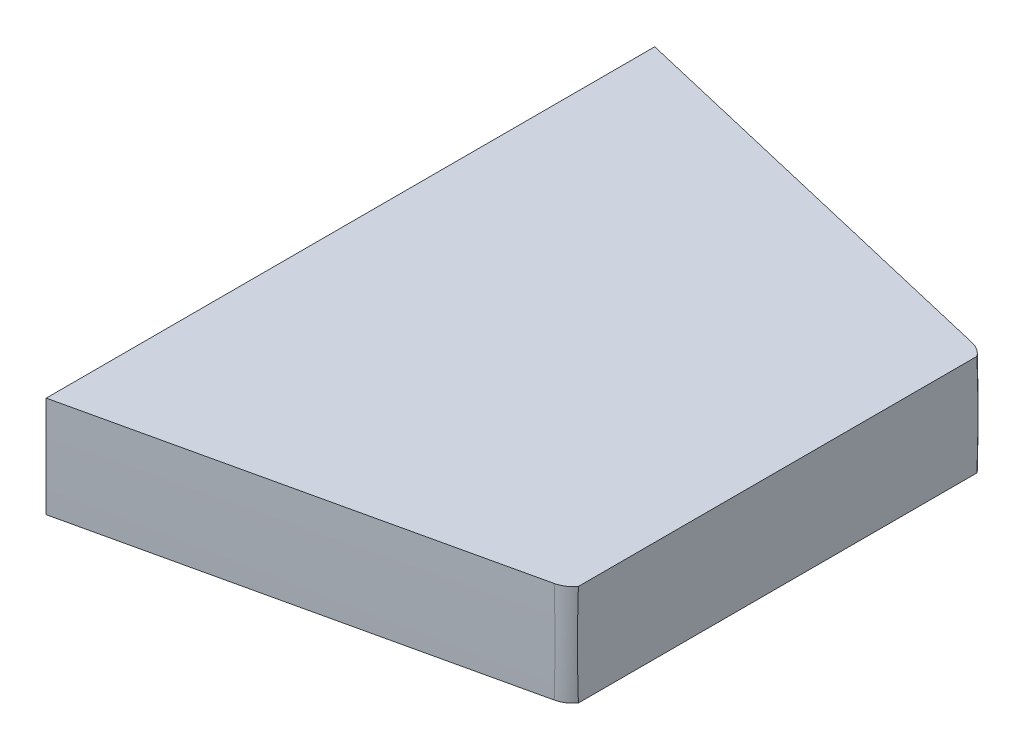
ISO-10303-21;
HEADER;
FILE_DESCRIPTION(('STEP AP214'),'2;1');
FILE_NAME('part.step','',(''),(''),'','','');
FILE_SCHEMA(('AUTOMOTIVE_DESIGN { 1 0 10303 214 1 1 1 1 }'));
ENDSEC;
DATA;
#1=APPLICATION_CONTEXT('core data for automotive mechanical design processes');
#2=APPLICATION_PROTOCOL_DEFINITION('international standard','automotive_design',2000,#1);
#3=PRODUCT_CONTEXT('',#1,'mechanical');
#4=PRODUCT('Part','Part','',(#3));
#5=PRODUCT_RELATED_PRODUCT_CATEGORY('part','',(#4));
#6=PRODUCT_DEFINITION_FORMATION('','',#4);
#7=PRODUCT_DEFINITION_CONTEXT('part definition',#1,'design');
#8=PRODUCT_DEFINITION('design','',#6,#7);
#9=PRODUCT_DEFINITION_SHAPE('','',#8);
#10=(LENGTH_UNIT() NAMED_UNIT(*) SI_UNIT(.MILLI.,.METRE.));
#11=(NAMED_UNIT(*) PLANE_ANGLE_UNIT() SI_UNIT($,.RADIAN.));
#12=(NAMED_UNIT(*) SI_UNIT($,.STERADIAN.) SOLID_ANGLE_UNIT());
#13=UNCERTAINTY_MEASURE_WITH_UNIT(LENGTH_MEASURE(1.E-05),#10,'distance_accuracy_value','');
#14=(GEOMETRIC_REPRESENTATION_CONTEXT(3) GLOBAL_UNCERTAINTY_ASSIGNED_CONTEXT((#13)) GLOBAL_UNIT_ASSIGNED_CONTEXT((#10,
#11,#12)) REPRESENTATION_CONTEXT('',''));
#15=CARTESIAN_POINT('',(0.,0.,0.));
#16=DIRECTION('',(0.,0.,1.));
#17=DIRECTION('',(1.,0.,0.));
#18=AXIS2_PLACEMENT_3D('',#15,#16,#17);
#19=CARTESIAN_POINT('',(1.63861979540769E-11,-5.18790739534314E-13,12.5584214245509));
#20=DIRECTION('',(0.,0.,-1.));
#21=DIRECTION('',(-1.,0.,0.));
#22=AXIS2_PLACEMENT_3D('',#19,#20,#21);
#23=CONICAL_SURFACE('',#22,33.2247053870836,1.34888360871233);
#24=CARTESIAN_POINT('',(33.2096529344975,-1.00000001490116,12.5584214245498));
#25=CARTESIAN_POINT('',(31.8413887405276,-1.00000001490116,12.8670076237268));
#26=CARTESIAN_POINT('',(30.4731189300786,-1.00000001490116,13.1755689153382));
#27=CARTESIAN_POINT('',(27.7365680760949,-1.00000001490116,13.7926416834585));
#28=CARTESIAN_POINT('',(26.3682870325602,-1.00000001490116,14.1011531599675));
#29=CARTESIAN_POINT('',(25.0000003725464,-1.00000001490116,14.4096397289109));
#30=B_SPLINE_CURVE_WITH_KNOTS('',3,(#24,#25,#26,#27,#28,#29),.UNSPECIFIED.,.F.,.F.,(4,2,4),(0.,
4.20789152709554,8.41578305458392),.UNSPECIFIED.);
#31=CARTESIAN_POINT('',(33.2096529344975,-1.00000001490116,12.5584214245498));
#32=VERTEX_POINT('',#31);
#33=CARTESIAN_POINT('',(25.0000003725464,-1.00000001490116,14.4096397289109));
#34=VERTEX_POINT('',#33);
#35=EDGE_CURVE('E74',#32,#34,#30,.T.);
#36=ORIENTED_EDGE('',*,*,#35,.F.);
#37=CARTESIAN_POINT('',(-7.17828574359203E-12,-7.0830927928478E-13,12.5584214245498));
#38=DIRECTION('',(0.,0.,-1.));
#39=DIRECTION('',(-1.,0.,0.));
#40=AXIS2_PLACEMENT_3D('',#37,#38,#39);
#41=CIRCLE('',#40,33.224705387107);
#42=CARTESIAN_POINT('',(33.2096529344976,1.00000001489884,12.5584214245498));
#43=VERTEX_POINT('',#42);
#44=EDGE_CURVE('E81',#43,#32,#41,.T.);
#45=ORIENTED_EDGE('',*,*,#44,.F.);
#46=CARTESIAN_POINT('',(25.0000003725464,1.00000001489884,14.4096397289109));
#47=CARTESIAN_POINT('',(26.3682870325602,1.00000001489884,14.1011531599675));
#48=CARTESIAN_POINT('',(27.7365680760949,1.00000001489884,13.7926416834585));
#49=CARTESIAN_POINT('',(30.4731189300787,1.00000001489884,13.1755689153382));
#50=CARTESIAN_POINT('',(31.8413887405276,1.00000001489884,12.8670076237268));
#51=CARTESIAN_POINT('',(33.2096529344976,1.00000001489884,12.5584214245498));
#52=B_SPLINE_CURVE_WITH_KNOTS('',3,(#46,#47,#48,#49,#50,#51),.UNSPECIFIED.,.F.,.F.,(4,2,4),(0.,
4.20789152748842,8.41578305458399),.UNSPECIFIED.);
#53=CARTESIAN_POINT('',(25.0000003725464,1.00000001489884,14.4096397289109));
#54=VERTEX_POINT('',#53);
#55=EDGE_CURVE('E77',#54,#43,#52,.T.);
#56=ORIENTED_EDGE('',*,*,#55,.F.);
#57=CARTESIAN_POINT('',(25.0000003725464,-1.00000001490115,14.4096397289109));
#58=CARTESIAN_POINT('',(25.0000003725464,-0.666666676601154,14.4126469085399));
#59=CARTESIAN_POINT('',(25.0000003725464,-0.333333338301154,14.4141504983544));
#60=CARTESIAN_POINT('',(25.0000003725464,0.333333338298848,14.4141504983544));
#61=CARTESIAN_POINT('',(25.0000003725464,0.666666676598849,14.4126469085399));
#62=CARTESIAN_POINT('',(25.0000003725464,1.00000001489885,14.4096397289109));
#63=B_SPLINE_CURVE_WITH_KNOTS('',3,(#57,#58,#59,#60,#61,#62),.UNSPECIFIED.,.F.,.F.,(4,2,4),(0.,
1.00001018836859,2.00002037673717),.UNSPECIFIED.);
#64=EDGE_CURVE('E22',#34,#54,#63,.T.);
#65=ORIENTED_EDGE('',*,*,#64,.F.);
#66=EDGE_LOOP('',(#36,#45,#56,#65));
#67=FACE_BOUND('',#66,.T.);
#68=ADVANCED_FACE('F17',(#67),#23,.T.);
#69=CARTESIAN_POINT('',(25.0000003725464,-1.01000001490116,2.33806122525438));
#70=DIRECTION('',(-1.,0.,0.));
#71=DIRECTION('',(0.,0.,1.));
#72=AXIS2_PLACEMENT_3D('',#69,#70,#71);
#73=PLANE('',#72);
#74=CARTESIAN_POINT('',(25.0000003725464,-1.00000001490119,2.35746474966418));
#75=CARTESIAN_POINT('',(25.000000298224,-0.916652167432191,2.35668095743818));
#76=CARTESIAN_POINT('',(25.0000001193455,-0.833303399463384,2.35599498502336));
#77=CARTESIAN_POINT('',(24.9999998223228,-0.666627191496445,2.35481907453882));
#78=CARTESIAN_POINT('',(24.9999997041619,-0.583299751874755,2.35432908310761));
#79=CARTESIAN_POINT('',(24.999999798083,-0.416649568633765,2.35354512839005));
#80=CARTESIAN_POINT('',(25.0000000101426,-0.333326825076644,2.35325115188909));
#81=CARTESIAN_POINT('',(25.0000005068397,-0.166669387722417,2.35285917759171));
#82=CARTESIAN_POINT('',(25.0000007914873,-0.0833346938617517,2.35276120682422));
#83=CARTESIAN_POINT('',(25.0000007914873,0.0833346938595561,2.35276120682422));
#84=CARTESIAN_POINT('',(25.0000005068397,0.166669387720199,2.35285917759171));
#85=CARTESIAN_POINT('',(25.0000000101426,0.333326825074382,2.35325115188909));
#86=CARTESIAN_POINT('',(24.999999798083,0.416649568631481,2.35354512839005));
#87=CARTESIAN_POINT('',(24.9999997041619,0.583299751872433,2.35432908310761));
#88=CARTESIAN_POINT('',(24.9999998223228,0.666627191494109,2.35481907453882));
#89=CARTESIAN_POINT('',(25.0000001193455,0.833303399461025,2.35599498502336));
#90=CARTESIAN_POINT('',(25.000000298224,0.916652167429825,2.35668095743817));
#91=CARTESIAN_POINT('',(25.0000003725464,1.00000001489882,2.35746474966418));
#92=B_SPLINE_CURVE_WITH_KNOTS('',3,(#74,#75,#76,#77,#78,#79,#80,#81,#82,#83,#84,#85,#86,#87,#88,
#89,#90,#91),.UNSPECIFIED.,.F.,.F.,(4,2,2,2,2,2,2,2,4),(0.,0.25005454168592,0.50004095237242,
0.750010508185632,1.00001453208714,1.25001855598858,1.49998811180173,1.74997452248818,
2.00002906417408),.UNSPECIFIED.);
#93=CARTESIAN_POINT('',(25.0000003725464,-1.00000001490118,2.35746474966418));
#94=VERTEX_POINT('',#93);
#95=CARTESIAN_POINT('',(25.0000003725464,1.00000001489884,2.35746474966418));
#96=VERTEX_POINT('',#95);
#97=EDGE_CURVE('E87',#94,#96,#92,.T.);
#98=ORIENTED_EDGE('',*,*,#97,.F.);
#99=DIRECTION('',(0.,0.,-1.));
#100=VECTOR('',#99,1.);
#101=CARTESIAN_POINT('',(25.0000003725464,-1.00000001490116,8.38355223928756));
#102=LINE('',#101,#100);
#103=EDGE_CURVE('E84',#34,#94,#102,.T.);
#104=ORIENTED_EDGE('',*,*,#103,.F.);
#105=ORIENTED_EDGE('',*,*,#64,.T.);
#106=DIRECTION('',(0.,0.,1.));
#107=VECTOR('',#106,1.);
#108=CARTESIAN_POINT('',(25.0000003725464,1.00000001489884,8.38355223928754));
#109=LINE('',#108,#107);
#110=EDGE_CURVE('E124',#96,#54,#109,.T.);
#111=ORIENTED_EDGE('',*,*,#110,.F.);
#112=EDGE_LOOP('',(#98,#104,#105,#111));
#113=FACE_BOUND('',#112,.T.);
#114=ADVANCED_FACE('F85',(#113),#73,.T.);
#115=CARTESIAN_POINT('',(1.27189925258619E-11,-7.28367019475762E-13,12.0706822982081));
#116=DIRECTION('',(0.,0.,-1.));
#117=DIRECTION('',(-1.,0.,0.));
#118=AXIS2_PLACEMENT_3D('',#115,#116,#117);
#119=TOROIDAL_SURFACE('',#118,33.1146574673646,0.499999999999809);
#120=CARTESIAN_POINT('',(33.5000003725465,-1.00000001490116,12.3703286992378));
#121=CARTESIAN_POINT('',(33.4829055419209,-1.00000001490116,12.3931883182461));
#122=CARTESIAN_POINT('',(33.4638278411576,-1.00000001490116,12.4145480482806));
#123=CARTESIAN_POINT('',(33.4229271085558,-1.00000001490116,12.4531581174169));
#124=CARTESIAN_POINT('',(33.4011991952655,-1.00000001490116,12.4705092618969));
#125=CARTESIAN_POINT('',(33.3530501589402,-1.00000001490116,12.5027839242995));
#126=CARTESIAN_POINT('',(33.326381449298,-1.00000001490116,12.5173395018995));
#127=CARTESIAN_POINT('',(33.2699629830464,-1.00000001490116,12.5418209984451));
#128=CARTESIAN_POINT('',(33.2401413125483,-1.00000001490116,12.5515812912889));
#129=CARTESIAN_POINT('',(33.2096529344975,-1.00000001490116,12.5584214245498));
#130=B_SPLINE_CURVE_WITH_KNOTS('',3,(#120,#121,#122,#123,#124,#125,#126,#127,#128,#129),
.UNSPECIFIED.,.F.,.F.,(4,2,2,2,4),(0.,0.0855072323680957,0.16854675970834,0.259192469447956,
0.352780715745465),.UNSPECIFIED.);
#131=CARTESIAN_POINT('',(33.5000003725464,-1.00000001490116,12.3703286992378));
#132=VERTEX_POINT('',#131);
#133=EDGE_CURVE('E95',#132,#32,#130,.T.);
#134=ORIENTED_EDGE('',*,*,#133,.F.);
#135=CARTESIAN_POINT('',(33.5000003725464,1.00000001489884,12.3703286992379));
#136=CARTESIAN_POINT('',(33.5000003725464,0.916692201357339,12.3736426204402));
#137=CARTESIAN_POINT('',(33.5000003725464,0.833366493608387,12.3764702957254));
#138=CARTESIAN_POINT('',(33.5000003725464,0.666691093795641,12.3812395684105));
#139=CARTESIAN_POINT('',(33.5000003725464,0.583341402197826,12.3831811819972));
#140=CARTESIAN_POINT('',(33.5000003725464,0.333330278767769,12.3878055746088));
#141=CARTESIAN_POINT('',(33.5000003725464,0.166646031841015,12.3892901958144));
#142=CARTESIAN_POINT('',(33.5000003725464,-0.166709724574945,12.3892897344554));
#143=CARTESIAN_POINT('',(33.5000003725464,-0.333381234064518,12.3878048787313));
#144=CARTESIAN_POINT('',(33.5000003725464,-0.58337324995586,12.3831804699699));
#145=CARTESIAN_POINT('',(33.5000003725464,-0.666716569744633,12.3812389070245));
#146=CARTESIAN_POINT('',(33.5000003725464,-0.83337922888997,12.3764698643247));
#147=CARTESIAN_POINT('',(33.5000003725464,-0.916698567780592,12.3736423683853));
#148=CARTESIAN_POINT('',(33.5000003725464,-1.00000001490116,12.3703286992379));
#149=B_SPLINE_CURVE_WITH_KNOTS('',3,(#135,#136,#137,#138,#139,#140,#141,#142,#143,#144,#145,
#146,#147,#148),.UNSPECIFIED.,.F.,.F.,(4,2,2,2,2,2,4),(0.,0.250117350514379,0.500230131639355,
1.00027329810707,1.50027826738761,1.75037193552021,2.00047017287133),.UNSPECIFIED.);
#150=CARTESIAN_POINT('',(33.5000003725464,1.00000001489884,12.3703286992379));
#151=VERTEX_POINT('',#150);
#152=EDGE_CURVE('E158',#151,#132,#149,.T.);
#153=ORIENTED_EDGE('',*,*,#152,.F.);
#154=CARTESIAN_POINT('',(33.2096529344976,1.00000001489884,12.5584214245498));
#155=CARTESIAN_POINT('',(33.2375087140054,1.00000001489884,12.5521604756913));
#156=CARTESIAN_POINT('',(33.2648065271506,1.00000001489884,12.5434777025176));
#157=CARTESIAN_POINT('',(33.3167735197107,1.00000001489884,12.5219270480837));
#158=CARTESIAN_POINT('',(33.3414958304627,1.00000001489884,12.5091872045349));
#159=CARTESIAN_POINT('',(33.3906323176512,1.00000001489884,12.4784366850298));
#160=CARTESIAN_POINT('',(33.4148130226401,1.00000001489884,12.4600514291806));
#161=CARTESIAN_POINT('',(33.4602082221341,1.00000001489884,12.4185769207837));
#162=CARTESIAN_POINT('',(33.4813009797429,1.00000001489884,12.395354366991));
#163=CARTESIAN_POINT('',(33.5000003725465,1.00000001489884,12.3703286992378));
#164=B_SPLINE_CURVE_WITH_KNOTS('',3,(#154,#155,#156,#157,#158,#159,#160,#161,#162,#163),
.UNSPECIFIED.,.F.,.F.,(4,2,2,2,4),(0.,0.0855261834676214,0.168583650326287,0.259211530565942,
0.352780705589164),.UNSPECIFIED.);
#165=EDGE_CURVE('E147',#43,#151,#164,.T.);
#166=ORIENTED_EDGE('',*,*,#165,.F.);
#167=ORIENTED_EDGE('',*,*,#44,.T.);
#168=EDGE_LOOP('',(#134,#153,#166,#167));
#169=FACE_BOUND('',#168,.T.);
#170=ADVANCED_FACE('F152',(#169),#119,.T.);
#171=CARTESIAN_POINT('',(33.5100003725464,-1.00000001490116,14.4196397289109));
#172=DIRECTION('',(0.,-1.,0.));
#173=DIRECTION('',(-1.,0.,0.));
#174=AXIS2_PLACEMENT_3D('',#171,#172,#173);
#175=PLANE('',#174);
#176=CARTESIAN_POINT('',(33.214118396031,-1.00000001490116,4.28888778514572));
#177=CARTESIAN_POINT('',(33.2419096820321,-1.00000001490116,4.29540152126857));
#178=CARTESIAN_POINT('',(33.2691218907784,-1.00000001490116,4.30433206715076));
#179=CARTESIAN_POINT('',(33.3208900764462,-1.00000001490116,4.32635652471382));
#180=CARTESIAN_POINT('',(33.3454996520018,-1.00000001490116,4.33932453025365));
#181=CARTESIAN_POINT('',(33.3937392591226,-1.00000001490116,4.37013124788007));
#182=CARTESIAN_POINT('',(33.4172034575591,-1.00000001490116,4.38823037852797));
#183=CARTESIAN_POINT('',(33.4612766009286,-1.00000001490116,4.42888576455644));
#184=CARTESIAN_POINT('',(33.4817734291207,-1.00000001490116,4.45156361153741));
#185=CARTESIAN_POINT('',(33.5000003725465,-1.00000001490116,4.47595192312837));
#186=B_SPLINE_CURVE_WITH_KNOTS('',3,(#176,#177,#178,#179,#180,#181,#182,#183,#184,#185),
.UNSPECIFIED.,.F.,.F.,(4,2,2,2,4),(0.,0.0855094655501174,0.168581977583652,0.257018074925815,
0.348217305348182),.UNSPECIFIED.);
#187=CARTESIAN_POINT('',(33.214118396031,-1.00000001490116,4.28888778514572));
#188=VERTEX_POINT('',#187);
#189=CARTESIAN_POINT('',(33.5000003725464,-1.00000001490116,4.47595192312837));
#190=VERTEX_POINT('',#189);
#191=EDGE_CURVE('E91',#188,#190,#186,.T.);
#192=ORIENTED_EDGE('',*,*,#191,.T.);
#193=DIRECTION('',(0.,0.,-1.));
#194=VECTOR('',#193,1.);
#195=CARTESIAN_POINT('',(33.5000003725464,-1.00000001490116,8.42314031118308));
#196=LINE('',#195,#194);
#197=EDGE_CURVE('E163',#132,#190,#196,.T.);
#198=ORIENTED_EDGE('',*,*,#197,.F.);
#199=ORIENTED_EDGE('',*,*,#133,.T.);
#200=ORIENTED_EDGE('',*,*,#35,.T.);
#201=ORIENTED_EDGE('',*,*,#103,.T.);
#202=CARTESIAN_POINT('',(33.214118396031,-1.00000001490116,4.28888778514572));
#203=CARTESIAN_POINT('',(31.8451108988778,-1.00000001490116,3.96693217403391));
#204=CARTESIAN_POINT('',(30.4760973150453,-1.00000001490116,3.64500244886265));
#205=CARTESIAN_POINT('',(27.7380579738837,-1.00000001490116,3.0011947703688));
#206=CARTESIAN_POINT('',(26.3690322165547,-1.00000001490116,2.67931681704621));
#207=CARTESIAN_POINT('',(25.0000003725464,-1.00000001490116,2.35746474966418));
#208=B_SPLINE_CURVE_WITH_KNOTS('',3,(#202,#203,#204,#205,#206,#207),.UNSPECIFIED.,.F.,.F.,(4,2,
4),(0.,4.21906772474692,8.43813544991903),.UNSPECIFIED.);
#209=EDGE_CURVE('E123',#188,#94,#208,.T.);
#210=ORIENTED_EDGE('',*,*,#209,.F.);
#211=EDGE_LOOP('',(#192,#198,#199,#200,#201,#210));
#212=FACE_BOUND('',#211,.T.);
#213=ADVANCED_FACE('F93',(#212),#175,.T.);
#214=CARTESIAN_POINT('',(24.9900003725464,1.00000001489884,14.4196397289109));
#215=DIRECTION('',(0.,1.,0.));
#216=DIRECTION('',(1.,0.,0.));
#217=AXIS2_PLACEMENT_3D('',#214,#215,#216);
#218=PLANE('',#217);
#219=ORIENTED_EDGE('',*,*,#110,.T.);
#220=ORIENTED_EDGE('',*,*,#55,.T.);
#221=ORIENTED_EDGE('',*,*,#165,.T.);
#222=DIRECTION('',(0.,0.,1.));
#223=VECTOR('',#222,1.);
#224=CARTESIAN_POINT('',(33.5000003725464,1.00000001489884,8.42314031118308));
#225=LINE('',#224,#223);
#226=CARTESIAN_POINT('',(33.5000003725464,1.00000001489884,4.4759519231283));
#227=VERTEX_POINT('',#226);
#228=EDGE_CURVE('E182',#227,#151,#225,.T.);
#229=ORIENTED_EDGE('',*,*,#228,.F.);
#230=CARTESIAN_POINT('',(33.5000003725464,1.00000001489884,4.47595192312832));
#231=CARTESIAN_POINT('',(33.482909623567,1.00000001489884,4.45309675462603));
#232=CARTESIAN_POINT('',(33.4638353847154,1.00000001489884,4.43174062068682));
#233=CARTESIAN_POINT('',(33.4229350065356,1.00000001489884,4.39312906945116));
#234=CARTESIAN_POINT('',(33.4012027661312,1.00000001489884,4.37577414574384));
#235=CARTESIAN_POINT('',(33.3536588614985,1.00000001489884,4.34390429883232));
#236=CARTESIAN_POINT('',(33.3276738661658,1.00000001489884,4.32964724850724));
#237=CARTESIAN_POINT('',(33.272762414234,1.00000001489884,4.30553385058148));
#238=CARTESIAN_POINT('',(33.2437694115084,1.00000001489884,4.2958289536019));
#239=CARTESIAN_POINT('',(33.2141183960311,1.00000001489884,4.28888778514573));
#240=B_SPLINE_CURVE_WITH_KNOTS('',3,(#230,#231,#232,#233,#234,#235,#236,#237,#238,#239),
.UNSPECIFIED.,.F.,.F.,(4,2,2,2,4),(0.,0.0854913742692753,0.168546763024155,0.256999909325981,
0.348217312733459),.UNSPECIFIED.);
#241=CARTESIAN_POINT('',(33.2141183960311,1.00000001489884,4.28888778514573));
#242=VERTEX_POINT('',#241);
#243=EDGE_CURVE('E41',#227,#242,#240,.T.);
#244=ORIENTED_EDGE('',*,*,#243,.T.);
#245=CARTESIAN_POINT('',(25.0000003725464,1.00000001489884,2.35746474966418));
#246=CARTESIAN_POINT('',(26.3690322165547,1.00000001489884,2.67931681704621));
#247=CARTESIAN_POINT('',(27.7380579738837,1.00000001489884,3.0011947703688));
#248=CARTESIAN_POINT('',(30.4760973150453,1.00000001489884,3.64500244886266));
#249=CARTESIAN_POINT('',(31.8451108988778,1.00000001489884,3.96693217403392));
#250=CARTESIAN_POINT('',(33.2141183960311,1.00000001489884,4.28888778514573));
#251=B_SPLINE_CURVE_WITH_KNOTS('',3,(#245,#246,#247,#248,#249,#250),.UNSPECIFIED.,.F.,.F.,(4,2,
4),(0.,4.21906772517214,8.43813544991911),.UNSPECIFIED.);
#252=EDGE_CURVE('E141',#96,#242,#251,.T.);
#253=ORIENTED_EDGE('',*,*,#252,.F.);
#254=EDGE_LOOP('',(#219,#220,#221,#229,#244,#253));
#255=FACE_BOUND('',#254,.T.);
#256=ADVANCED_FACE('F133',(#255),#218,.T.);
#257=CARTESIAN_POINT('',(-8.30932544992891E-12,-1.0806243053163E-12,2.35119072018245));
#258=DIRECTION('',(0.,0.,1.));
#259=DIRECTION('',(1.,0.,0.));
#260=AXIS2_PLACEMENT_3D('',#257,#258,#259);
#261=CONICAL_SURFACE('',#260,24.9933257121823,1.33972273017406);
#262=ORIENTED_EDGE('',*,*,#252,.T.);
#263=CARTESIAN_POINT('',(5.56846235788555E-12,-7.18283939271647E-13,4.28888778514573));
#264=DIRECTION('',(0.,0.,1.));
#265=DIRECTION('',(1.,0.,0.));
#266=AXIS2_PLACEMENT_3D('',#263,#264,#265);
#267=CIRCLE('',#266,33.2291688258223);
#268=EDGE_CURVE('E33',#188,#242,#267,.T.);
#269=ORIENTED_EDGE('',*,*,#268,.F.);
#270=ORIENTED_EDGE('',*,*,#209,.T.);
#271=ORIENTED_EDGE('',*,*,#97,.T.);
#272=EDGE_LOOP('',(#262,#269,#270,#271));
#273=FACE_BOUND('',#272,.T.);
#274=ADVANCED_FACE('F136',(#273),#261,.T.);
#275=CARTESIAN_POINT('',(33.5000003725464,-1.01000001490116,12.3992899651523));
#276=DIRECTION('',(1.,0.,0.));
#277=DIRECTION('',(0.,0.,-1.));
#278=AXIS2_PLACEMENT_3D('',#275,#276,#277);
#279=PLANE('',#278);
#280=CARTESIAN_POINT('',(33.5000003725464,1.00000001489885,4.47595192312826));
#281=CARTESIAN_POINT('',(33.5000003725464,0.916692201357324,4.47263800192596));
#282=CARTESIAN_POINT('',(33.5000003725464,0.833366493608357,4.46981032664077));
#283=CARTESIAN_POINT('',(33.5000003725464,0.666691093795579,4.46504105395567));
#284=CARTESIAN_POINT('',(33.5000003725464,0.583341402197749,4.46309944036898));
#285=CARTESIAN_POINT('',(33.5000003725464,0.333330278767645,4.45847504775733));
#286=CARTESIAN_POINT('',(33.5000003725464,0.16664603184086,4.45699042655183));
#287=CARTESIAN_POINT('',(33.5000003725464,-0.1667097245751,4.45699088791082));
#288=CARTESIAN_POINT('',(33.5000003725464,-0.333381234064641,4.45847574363488));
#289=CARTESIAN_POINT('',(33.5000003725464,-0.583373249955937,4.46310015239627));
#290=CARTESIAN_POINT('',(33.5000003725464,-0.666716569744694,4.4650417153417));
#291=CARTESIAN_POINT('',(33.5000003725464,-0.83337922889,4.46981075804148));
#292=CARTESIAN_POINT('',(33.5000003725464,-0.916698567780606,4.47263825398092));
#293=CARTESIAN_POINT('',(33.5000003725464,-1.00000001490116,4.47595192312827));
#294=B_SPLINE_CURVE_WITH_KNOTS('',3,(#280,#281,#282,#283,#284,#285,#286,#287,#288,#289,#290,
#291,#292,#293),.UNSPECIFIED.,.F.,.F.,(4,2,2,2,2,2,4),(0.,0.250117350514426,0.500230131639448,
1.00027329810726,1.50027826738771,1.75037193552026,2.00047017287133),.UNSPECIFIED.);
#295=EDGE_CURVE('E11',#227,#190,#294,.T.);
#296=ORIENTED_EDGE('',*,*,#295,.F.);
#297=ORIENTED_EDGE('',*,*,#228,.T.);
#298=ORIENTED_EDGE('',*,*,#152,.T.);
#299=ORIENTED_EDGE('',*,*,#197,.T.);
#300=EDGE_LOOP('',(#296,#297,#298,#299));
#301=FACE_BOUND('',#300,.T.);
#302=ADVANCED_FACE('F168',(#301),#279,.T.);
#303=CARTESIAN_POINT('',(5.5649929109336E-12,-7.18175519054398E-13,4.77559832415808));
#304=DIRECTION('',(0.,0.,-1.));
#305=DIRECTION('',(-1.,0.,0.));
#306=AXIS2_PLACEMENT_3D('',#303,#304,#305);
#307=TOROIDAL_SURFACE('',#306,33.1146574673717,0.499999999999903);
#308=ORIENTED_EDGE('',*,*,#243,.F.);
#309=ORIENTED_EDGE('',*,*,#295,.T.);
#310=ORIENTED_EDGE('',*,*,#191,.F.);
#311=ORIENTED_EDGE('',*,*,#268,.T.);
#312=EDGE_LOOP('',(#308,#309,#310,#311));
#313=FACE_BOUND('',#312,.T.);
#314=ADVANCED_FACE('F19',(#313),#307,.T.);
#315=CLOSED_SHELL('',(#68,#114,#170,#213,#256,#274,#302,#314));
#316=MANIFOLD_SOLID_BREP('B1',#315);
#317=ADVANCED_BREP_SHAPE_REPRESENTATION('',(#18,#316),#14);
#318=SHAPE_DEFINITION_REPRESENTATION(#9,#317);
ENDSEC;
END-ISO-10303-21;
